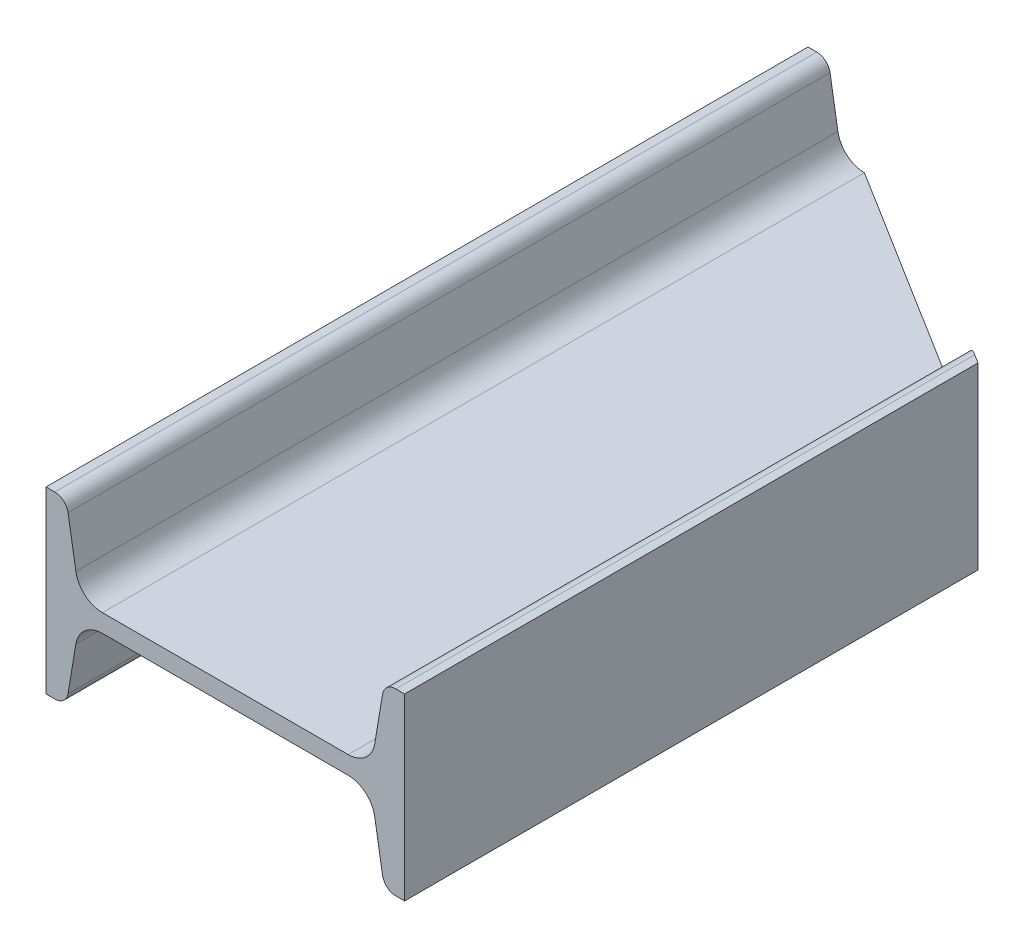
ISO-10303-21;
HEADER;
FILE_DESCRIPTION(('STEP AP214'),'2;1');
FILE_NAME('part.step','',(''),(''),'','','');
FILE_SCHEMA(('AUTOMOTIVE_DESIGN { 1 0 10303 214 1 1 1 1 }'));
ENDSEC;
DATA;
#1=APPLICATION_CONTEXT('core data for automotive mechanical design processes');
#2=APPLICATION_PROTOCOL_DEFINITION('international standard','automotive_design',2000,#1);
#3=PRODUCT_CONTEXT('',#1,'mechanical');
#4=PRODUCT('Part','Part','',(#3));
#5=PRODUCT_RELATED_PRODUCT_CATEGORY('part','',(#4));
#6=PRODUCT_DEFINITION_FORMATION('','',#4);
#7=PRODUCT_DEFINITION_CONTEXT('part definition',#1,'design');
#8=PRODUCT_DEFINITION('design','',#6,#7);
#9=PRODUCT_DEFINITION_SHAPE('','',#8);
#10=(LENGTH_UNIT() NAMED_UNIT(*) SI_UNIT(.MILLI.,.METRE.));
#11=(NAMED_UNIT(*) PLANE_ANGLE_UNIT() SI_UNIT($,.RADIAN.));
#12=(NAMED_UNIT(*) SI_UNIT($,.STERADIAN.) SOLID_ANGLE_UNIT());
#13=UNCERTAINTY_MEASURE_WITH_UNIT(LENGTH_MEASURE(1.E-05),#10,'distance_accuracy_value','');
#14=(GEOMETRIC_REPRESENTATION_CONTEXT(3) GLOBAL_UNCERTAINTY_ASSIGNED_CONTEXT((#13)) GLOBAL_UNIT_ASSIGNED_CONTEXT((#10,
#11,#12)) REPRESENTATION_CONTEXT('',''));
#15=CARTESIAN_POINT('',(0.,0.,0.));
#16=DIRECTION('',(0.,0.,1.));
#17=DIRECTION('',(1.,0.,0.));
#18=AXIS2_PLACEMENT_3D('',#15,#16,#17);
#19=CARTESIAN_POINT('',(-40.,20.,-85.));
#20=DIRECTION('',(1.,0.,0.));
#21=DIRECTION('',(0.,0.,-1.));
#22=AXIS2_PLACEMENT_3D('',#19,#20,#21);
#23=PLANE('',#22);
#24=DIRECTION('',(0.,1.,0.));
#25=VECTOR('',#24,1.);
#26=CARTESIAN_POINT('',(-40.,20.,85.));
#27=LINE('',#26,#25);
#28=CARTESIAN_POINT('',(-40.,-20.,85.));
#29=VERTEX_POINT('',#28);
#30=CARTESIAN_POINT('',(-40.,20.,85.));
#31=VERTEX_POINT('',#30);
#32=EDGE_CURVE('E239',#29,#31,#27,.T.);
#33=ORIENTED_EDGE('',*,*,#32,.T.);
#34=DIRECTION('',(0.,0.,1.));
#35=VECTOR('',#34,1.);
#36=CARTESIAN_POINT('',(-40.,20.,-85.));
#37=LINE('',#36,#35);
#38=CARTESIAN_POINT('',(-40.,20.,-85.));
#39=VERTEX_POINT('',#38);
#40=EDGE_CURVE('E107',#39,#31,#37,.T.);
#41=ORIENTED_EDGE('',*,*,#40,.F.);
#42=DIRECTION('',(0.,1.,0.));
#43=VECTOR('',#42,1.);
#44=CARTESIAN_POINT('',(-40.,20.,-85.));
#45=LINE('',#44,#43);
#46=CARTESIAN_POINT('',(-40.,-20.,-85.));
#47=VERTEX_POINT('',#46);
#48=EDGE_CURVE('E288',#47,#39,#45,.T.);
#49=ORIENTED_EDGE('',*,*,#48,.F.);
#50=DIRECTION('',(0.,0.,1.));
#51=VECTOR('',#50,1.);
#52=CARTESIAN_POINT('',(-40.,-20.,-85.));
#53=LINE('',#52,#51);
#54=EDGE_CURVE('E235',#47,#29,#53,.T.);
#55=ORIENTED_EDGE('',*,*,#54,.T.);
#56=EDGE_LOOP('',(#33,#41,#49,#55));
#57=FACE_BOUND('',#56,.T.);
#58=ADVANCED_FACE('F99',(#57),#23,.F.);
#59=CARTESIAN_POINT('',(-38.0414602116945,20.,-85.));
#60=DIRECTION('',(0.,-1.,0.));
#61=DIRECTION('',(1.,0.,0.));
#62=AXIS2_PLACEMENT_3D('',#59,#60,#61);
#63=PLANE('',#62);
#64=DIRECTION('',(1.,0.,0.));
#65=VECTOR('',#64,1.);
#66=CARTESIAN_POINT('',(-38.0414602116945,20.,85.));
#67=LINE('',#66,#65);
#68=CARTESIAN_POINT('',(-38.0414602116945,20.,85.));
#69=VERTEX_POINT('',#68);
#70=EDGE_CURVE('E242',#31,#69,#67,.T.);
#71=ORIENTED_EDGE('',*,*,#70,.T.);
#72=DIRECTION('',(0.,0.,1.));
#73=VECTOR('',#72,1.);
#74=CARTESIAN_POINT('',(-38.0414602116945,20.,-85.));
#75=LINE('',#74,#73);
#76=CARTESIAN_POINT('',(-38.0414602116945,20.,-85.));
#77=VERTEX_POINT('',#76);
#78=EDGE_CURVE('E324',#77,#69,#75,.T.);
#79=ORIENTED_EDGE('',*,*,#78,.F.);
#80=DIRECTION('',(1.,0.,0.));
#81=VECTOR('',#80,1.);
#82=CARTESIAN_POINT('',(-38.0414602116945,20.,-85.));
#83=LINE('',#82,#81);
#84=EDGE_CURVE('E196',#39,#77,#83,.T.);
#85=ORIENTED_EDGE('',*,*,#84,.F.);
#86=ORIENTED_EDGE('',*,*,#40,.T.);
#87=EDGE_LOOP('',(#71,#79,#85,#86));
#88=FACE_BOUND('',#87,.T.);
#89=ADVANCED_FACE('F327',(#88),#63,.F.);
#90=CARTESIAN_POINT('',(-38.0414602116945,17.,-85.));
#91=DIRECTION('',(0.,0.,1.));
#92=DIRECTION('',(0.,-1.,0.));
#93=AXIS2_PLACEMENT_3D('',#90,#91,#92);
#94=CYLINDRICAL_SURFACE('',#93,3.);
#95=CARTESIAN_POINT('',(-38.0414602116945,17.,85.));
#96=DIRECTION('',(0.,0.,-1.));
#97=DIRECTION('',(0.,1.,0.));
#98=AXIS2_PLACEMENT_3D('',#95,#96,#97);
#99=CIRCLE('',#98,3.);
#100=CARTESIAN_POINT('',(-35.082284274778,17.4932319681189,85.));
#101=VERTEX_POINT('',#100);
#102=EDGE_CURVE('E245',#69,#101,#99,.T.);
#103=ORIENTED_EDGE('',*,*,#102,.T.);
#104=DIRECTION('',(0.,0.,1.));
#105=VECTOR('',#104,1.);
#106=CARTESIAN_POINT('',(-35.082284274778,17.4932319681189,-85.));
#107=LINE('',#106,#105);
#108=CARTESIAN_POINT('',(-35.082284274778,17.4932319681189,-85.));
#109=VERTEX_POINT('',#108);
#110=EDGE_CURVE('E321',#109,#101,#107,.T.);
#111=ORIENTED_EDGE('',*,*,#110,.F.);
#112=CARTESIAN_POINT('',(-38.0414602116945,17.,-85.));
#113=DIRECTION('',(0.,0.,-1.));
#114=DIRECTION('',(0.,1.,0.));
#115=AXIS2_PLACEMENT_3D('',#112,#113,#114);
#116=CIRCLE('',#115,3.);
#117=EDGE_CURVE('E347',#77,#109,#116,.T.);
#118=ORIENTED_EDGE('',*,*,#117,.F.);
#119=ORIENTED_EDGE('',*,*,#78,.T.);
#120=EDGE_LOOP('',(#103,#111,#118,#119));
#121=FACE_BOUND('',#120,.T.);
#122=ADVANCED_FACE('F338',(#121),#94,.T.);
#123=CARTESIAN_POINT('',(-33.3355408751344,7.01353606376229,-85.));
#124=DIRECTION('',(-0.986391978972163,-0.164410656039623,0.));
#125=DIRECTION('',(0.164410656039623,-0.986391978972163,0.));
#126=AXIS2_PLACEMENT_3D('',#123,#124,#125);
#127=PLANE('',#126);
#128=DIRECTION('',(0.164410656039623,-0.986391978972163,0.));
#129=VECTOR('',#128,1.);
#130=CARTESIAN_POINT('',(-33.3355408751344,7.01353606376226,85.));
#131=LINE('',#130,#129);
#132=CARTESIAN_POINT('',(-33.3355408751344,7.01353606376226,85.));
#133=VERTEX_POINT('',#132);
#134=EDGE_CURVE('E247',#101,#133,#131,.T.);
#135=ORIENTED_EDGE('',*,*,#134,.T.);
#136=DIRECTION('',(0.,0.,1.));
#137=VECTOR('',#136,1.);
#138=CARTESIAN_POINT('',(-33.3355408751344,7.01353606376229,-85.));
#139=LINE('',#138,#137);
#140=CARTESIAN_POINT('',(-33.3355408751344,7.01353606376229,-85.));
#141=VERTEX_POINT('',#140);
#142=EDGE_CURVE('E318',#141,#133,#139,.T.);
#143=ORIENTED_EDGE('',*,*,#142,.F.);
#144=DIRECTION('',(0.164410656039623,-0.986391978972163,0.));
#145=VECTOR('',#144,1.);
#146=CARTESIAN_POINT('',(-33.3355408751344,7.01353606376229,-85.));
#147=LINE('',#146,#145);
#148=EDGE_CURVE('E344',#109,#141,#147,.T.);
#149=ORIENTED_EDGE('',*,*,#148,.F.);
#150=ORIENTED_EDGE('',*,*,#110,.T.);
#151=EDGE_LOOP('',(#135,#143,#149,#150));
#152=FACE_BOUND('',#151,.T.);
#153=ADVANCED_FACE('F342',(#152),#127,.F.);
#154=CARTESIAN_POINT('',(-27.4171890013014,8.00000000000003,-85.));
#155=DIRECTION('',(0.,0.,1.));
#156=DIRECTION('',(0.,-1.,0.));
#157=AXIS2_PLACEMENT_3D('',#154,#155,#156);
#158=CYLINDRICAL_SURFACE('',#157,6.);
#159=CARTESIAN_POINT('',(-27.4171890013014,8.,85.));
#160=DIRECTION('',(0.,0.,1.));
#161=DIRECTION('',(0.,1.,0.));
#162=AXIS2_PLACEMENT_3D('',#159,#160,#161);
#163=CIRCLE('',#162,6.);
#164=CARTESIAN_POINT('',(-27.4171890013014,1.99999999999999,85.));
#165=VERTEX_POINT('',#164);
#166=EDGE_CURVE('E249',#133,#165,#163,.T.);
#167=ORIENTED_EDGE('',*,*,#166,.T.);
#168=DIRECTION('',(0.,0.,1.));
#169=VECTOR('',#168,1.);
#170=CARTESIAN_POINT('',(-27.4171890013014,2.00000000000003,-85.));
#171=LINE('',#170,#169);
#172=CARTESIAN_POINT('',(-27.4171890013014,2.00000000000003,-85.));
#173=VERTEX_POINT('',#172);
#174=EDGE_CURVE('E315',#173,#165,#171,.T.);
#175=ORIENTED_EDGE('',*,*,#174,.F.);
#176=CARTESIAN_POINT('',(-27.4171890013014,8.00000000000003,-85.));
#177=DIRECTION('',(0.,0.,1.));
#178=DIRECTION('',(0.,1.,0.));
#179=AXIS2_PLACEMENT_3D('',#176,#177,#178);
#180=CIRCLE('',#179,6.);
#181=EDGE_CURVE('E346',#141,#173,#180,.T.);
#182=ORIENTED_EDGE('',*,*,#181,.F.);
#183=ORIENTED_EDGE('',*,*,#142,.T.);
#184=EDGE_LOOP('',(#167,#175,#182,#183));
#185=FACE_BOUND('',#184,.T.);
#186=ADVANCED_FACE('F446',(#185),#158,.F.);
#187=CARTESIAN_POINT('',(27.4171890013014,2.00000000000003,-85.));
#188=DIRECTION('',(0.,-1.,0.));
#189=DIRECTION('',(0.,0.,-1.));
#190=AXIS2_PLACEMENT_3D('',#187,#188,#189);
#191=PLANE('',#190);
#192=DIRECTION('',(0.,0.,1.));
#193=VECTOR('',#192,1.);
#194=CARTESIAN_POINT('',(27.4171890013014,2.00000000000003,-85.));
#195=LINE('',#194,#193);
#196=CARTESIAN_POINT('',(27.4171890013014,2.00000000000003,-50.7756087656373));
#197=VERTEX_POINT('',#196);
#198=CARTESIAN_POINT('',(27.4171890013014,2.,85.));
#199=VERTEX_POINT('',#198);
#200=EDGE_CURVE('E313',#197,#199,#195,.T.);
#201=ORIENTED_EDGE('',*,*,#200,.F.);
#202=DIRECTION('',(-0.848325599390186,0.,-0.529474907261224));
#203=VECTOR('',#202,1.);
#204=CARTESIAN_POINT('',(12.0447178230528,2.00000000000002,-60.3702004617147));
#205=LINE('',#204,#203);
#206=EDGE_CURVE('E243',#197,#173,#205,.T.);
#207=ORIENTED_EDGE('',*,*,#206,.T.);
#208=ORIENTED_EDGE('',*,*,#174,.T.);
#209=DIRECTION('',(1.,0.,0.));
#210=VECTOR('',#209,1.);
#211=CARTESIAN_POINT('',(27.4171890013014,1.99999999999999,85.));
#212=LINE('',#211,#210);
#213=EDGE_CURVE('E251',#165,#199,#212,.T.);
#214=ORIENTED_EDGE('',*,*,#213,.T.);
#215=EDGE_LOOP('',(#201,#207,#208,#214));
#216=FACE_BOUND('',#215,.T.);
#217=ADVANCED_FACE('F450',(#216),#191,.F.);
#218=CARTESIAN_POINT('',(27.4171890013014,8.00000000000004,-85.));
#219=DIRECTION('',(0.,0.,1.));
#220=DIRECTION('',(0.,-1.,0.));
#221=AXIS2_PLACEMENT_3D('',#218,#219,#220);
#222=CYLINDRICAL_SURFACE('',#221,6.00000000000001);
#223=DIRECTION('',(0.,0.,1.));
#224=VECTOR('',#223,1.);
#225=CARTESIAN_POINT('',(33.3355408751344,7.0135360637623,-85.));
#226=LINE('',#225,#224);
#227=CARTESIAN_POINT('',(33.3355408751343,7.01353606376227,-47.0817218762288));
#228=VERTEX_POINT('',#227);
#229=CARTESIAN_POINT('',(33.3355408751344,7.01353606376227,85.));
#230=VERTEX_POINT('',#229);
#231=EDGE_CURVE('E311',#228,#230,#226,.T.);
#232=ORIENTED_EDGE('',*,*,#231,.F.);
#233=CARTESIAN_POINT('',(27.4171890013014,8.00000000000003,-50.7756087656373));
#234=DIRECTION('',(-0.529474907261224,0.,0.848325599390186));
#235=DIRECTION('',(0.848325599390186,0.,0.529474907261224));
#236=AXIS2_PLACEMENT_3D('',#233,#234,#235);
#237=ELLIPSE('',#236,7.07275603177963,6.00000000000001);
#238=EDGE_CURVE('E356',#228,#197,#237,.F.);
#239=ORIENTED_EDGE('',*,*,#238,.T.);
#240=ORIENTED_EDGE('',*,*,#200,.T.);
#241=CARTESIAN_POINT('',(27.4171890013014,8.00000000000001,85.));
#242=DIRECTION('',(0.,0.,1.));
#243=DIRECTION('',(0.,1.,0.));
#244=AXIS2_PLACEMENT_3D('',#241,#242,#243);
#245=CIRCLE('',#244,6.00000000000001);
#246=EDGE_CURVE('E254',#199,#230,#245,.T.);
#247=ORIENTED_EDGE('',*,*,#246,.T.);
#248=EDGE_LOOP('',(#232,#239,#240,#247));
#249=FACE_BOUND('',#248,.T.);
#250=ADVANCED_FACE('F455',(#249),#222,.F.);
#251=CARTESIAN_POINT('',(35.082284274778,17.4932319681189,-85.));
#252=DIRECTION('',(0.986391978972163,-0.164410656039623,0.));
#253=DIRECTION('',(0.164410656039623,0.986391978972163,0.));
#254=AXIS2_PLACEMENT_3D('',#251,#252,#253);
#255=PLANE('',#254);
#256=DIRECTION('',(0.,0.,1.));
#257=VECTOR('',#256,1.);
#258=CARTESIAN_POINT('',(35.082284274778,17.4932319681189,-85.));
#259=LINE('',#258,#257);
#260=CARTESIAN_POINT('',(35.082284274778,17.4932319681189,-45.991507458321));
#261=VERTEX_POINT('',#260);
#262=CARTESIAN_POINT('',(35.082284274778,17.4932319681189,85.));
#263=VERTEX_POINT('',#262);
#264=EDGE_CURVE('E309',#261,#263,#259,.T.);
#265=ORIENTED_EDGE('',*,*,#264,.F.);
#266=DIRECTION('',(-0.163551816290353,-0.981239316363125,-0.102079417177778));
#267=VECTOR('',#266,1.);
#268=CARTESIAN_POINT('',(34.4310268001408,13.5859721547832,-46.3979840414096));
#269=LINE('',#268,#267);
#270=EDGE_CURVE('E359',#261,#228,#269,.T.);
#271=ORIENTED_EDGE('',*,*,#270,.T.);
#272=ORIENTED_EDGE('',*,*,#231,.T.);
#273=DIRECTION('',(0.164410656039623,0.986391978972163,0.));
#274=VECTOR('',#273,1.);
#275=CARTESIAN_POINT('',(35.082284274778,17.4932319681189,85.));
#276=LINE('',#275,#274);
#277=EDGE_CURVE('E257',#230,#263,#276,.T.);
#278=ORIENTED_EDGE('',*,*,#277,.T.);
#279=EDGE_LOOP('',(#265,#271,#272,#278));
#280=FACE_BOUND('',#279,.T.);
#281=ADVANCED_FACE('F463',(#280),#255,.F.);
#282=CARTESIAN_POINT('',(38.0414602116944,17.,-85.));
#283=DIRECTION('',(0.,0.,1.));
#284=DIRECTION('',(0.,-1.,0.));
#285=AXIS2_PLACEMENT_3D('',#282,#283,#284);
#286=CYLINDRICAL_SURFACE('',#285,3.);
#287=DIRECTION('',(0.,0.,1.));
#288=VECTOR('',#287,1.);
#289=CARTESIAN_POINT('',(38.0414602116945,20.,-85.));
#290=LINE('',#289,#288);
#291=CARTESIAN_POINT('',(38.0414602116945,20.,-44.1445640136168));
#292=VERTEX_POINT('',#291);
#293=CARTESIAN_POINT('',(38.0414602116945,20.,85.));
#294=VERTEX_POINT('',#293);
#295=EDGE_CURVE('E307',#292,#294,#290,.T.);
#296=ORIENTED_EDGE('',*,*,#295,.F.);
#297=CARTESIAN_POINT('',(38.0414602116944,17.,-44.1445640136168));
#298=DIRECTION('',(-0.529474907261224,0.,0.848325599390186));
#299=DIRECTION('',(0.848325599390186,0.,0.529474907261224));
#300=AXIS2_PLACEMENT_3D('',#297,#298,#299);
#301=ELLIPSE('',#300,3.53637801588981,3.);
#302=EDGE_CURVE('E362',#292,#261,#301,.T.);
#303=ORIENTED_EDGE('',*,*,#302,.T.);
#304=ORIENTED_EDGE('',*,*,#264,.T.);
#305=CARTESIAN_POINT('',(38.0414602116944,17.,85.));
#306=DIRECTION('',(0.,0.,-1.));
#307=DIRECTION('',(0.,1.,0.));
#308=AXIS2_PLACEMENT_3D('',#305,#306,#307);
#309=CIRCLE('',#308,3.);
#310=EDGE_CURVE('E260',#263,#294,#309,.T.);
#311=ORIENTED_EDGE('',*,*,#310,.T.);
#312=EDGE_LOOP('',(#296,#303,#304,#311));
#313=FACE_BOUND('',#312,.T.);
#314=ADVANCED_FACE('F462',(#313),#286,.T.);
#315=CARTESIAN_POINT('',(40.,20.,-85.));
#316=DIRECTION('',(0.,-1.,0.));
#317=DIRECTION('',(1.,0.,0.));
#318=AXIS2_PLACEMENT_3D('',#315,#316,#317);
#319=PLANE('',#318);
#320=DIRECTION('',(0.,0.,1.));
#321=VECTOR('',#320,1.);
#322=CARTESIAN_POINT('',(40.,20.,-85.));
#323=LINE('',#322,#321);
#324=CARTESIAN_POINT('',(40.,20.,-42.9221587561002));
#325=VERTEX_POINT('',#324);
#326=CARTESIAN_POINT('',(40.,20.,85.));
#327=VERTEX_POINT('',#326);
#328=EDGE_CURVE('E305',#325,#327,#323,.T.);
#329=ORIENTED_EDGE('',*,*,#328,.F.);
#330=DIRECTION('',(0.848325599390186,0.,0.529474907261224));
#331=VECTOR('',#330,1.);
#332=CARTESIAN_POINT('',(-27.4171890013014,20.,-85.));
#333=LINE('',#332,#331);
#334=EDGE_CURVE('E383',#292,#325,#333,.T.);
#335=ORIENTED_EDGE('',*,*,#334,.F.);
#336=ORIENTED_EDGE('',*,*,#295,.T.);
#337=DIRECTION('',(1.,0.,0.));
#338=VECTOR('',#337,1.);
#339=CARTESIAN_POINT('',(40.,20.,85.));
#340=LINE('',#339,#338);
#341=EDGE_CURVE('E263',#294,#327,#340,.T.);
#342=ORIENTED_EDGE('',*,*,#341,.T.);
#343=EDGE_LOOP('',(#329,#335,#336,#342));
#344=FACE_BOUND('',#343,.T.);
#345=ADVANCED_FACE('F404',(#344),#319,.F.);
#346=CARTESIAN_POINT('',(40.,-20.,-85.));
#347=DIRECTION('',(-1.,0.,0.));
#348=DIRECTION('',(0.,-1.,0.));
#349=AXIS2_PLACEMENT_3D('',#346,#347,#348);
#350=PLANE('',#349);
#351=DIRECTION('',(0.,0.,1.));
#352=VECTOR('',#351,1.);
#353=CARTESIAN_POINT('',(40.,-20.,-85.));
#354=LINE('',#353,#352);
#355=CARTESIAN_POINT('',(40.,-20.,-42.9221587561002));
#356=VERTEX_POINT('',#355);
#357=CARTESIAN_POINT('',(40.,-20.,85.));
#358=VERTEX_POINT('',#357);
#359=EDGE_CURVE('E303',#356,#358,#354,.T.);
#360=ORIENTED_EDGE('',*,*,#359,.F.);
#361=DIRECTION('',(0.,1.,0.));
#362=VECTOR('',#361,1.);
#363=CARTESIAN_POINT('',(40.,-20.,-42.9221587561002));
#364=LINE('',#363,#362);
#365=EDGE_CURVE('E365',#356,#325,#364,.T.);
#366=ORIENTED_EDGE('',*,*,#365,.T.);
#367=ORIENTED_EDGE('',*,*,#328,.T.);
#368=DIRECTION('',(0.,-1.,0.));
#369=VECTOR('',#368,1.);
#370=CARTESIAN_POINT('',(40.,-20.,85.));
#371=LINE('',#370,#369);
#372=EDGE_CURVE('E266',#327,#358,#371,.T.);
#373=ORIENTED_EDGE('',*,*,#372,.T.);
#374=EDGE_LOOP('',(#360,#366,#367,#373));
#375=FACE_BOUND('',#374,.T.);
#376=ADVANCED_FACE('F403',(#375),#350,.F.);
#377=CARTESIAN_POINT('',(38.0414602116945,-20.,-85.));
#378=DIRECTION('',(0.,1.,0.));
#379=DIRECTION('',(-1.,0.,0.));
#380=AXIS2_PLACEMENT_3D('',#377,#378,#379);
#381=PLANE('',#380);
#382=DIRECTION('',(0.,0.,1.));
#383=VECTOR('',#382,1.);
#384=CARTESIAN_POINT('',(38.0414602116945,-20.,-85.));
#385=LINE('',#384,#383);
#386=CARTESIAN_POINT('',(38.0414602116945,-20.,-44.1445640136168));
#387=VERTEX_POINT('',#386);
#388=CARTESIAN_POINT('',(38.0414602116945,-20.,85.));
#389=VERTEX_POINT('',#388);
#390=EDGE_CURVE('E301',#387,#389,#385,.T.);
#391=ORIENTED_EDGE('',*,*,#390,.F.);
#392=DIRECTION('',(0.848325599390186,0.,0.529474907261224));
#393=VECTOR('',#392,1.);
#394=CARTESIAN_POINT('',(-27.4171890013014,-20.,-85.));
#395=LINE('',#394,#393);
#396=EDGE_CURVE('E380',#387,#356,#395,.T.);
#397=ORIENTED_EDGE('',*,*,#396,.T.);
#398=ORIENTED_EDGE('',*,*,#359,.T.);
#399=DIRECTION('',(-1.,0.,0.));
#400=VECTOR('',#399,1.);
#401=CARTESIAN_POINT('',(38.0414602116945,-20.,85.));
#402=LINE('',#401,#400);
#403=EDGE_CURVE('E269',#358,#389,#402,.T.);
#404=ORIENTED_EDGE('',*,*,#403,.T.);
#405=EDGE_LOOP('',(#391,#397,#398,#404));
#406=FACE_BOUND('',#405,.T.);
#407=ADVANCED_FACE('F413',(#406),#381,.F.);
#408=CARTESIAN_POINT('',(38.0414602116945,-17.,-85.));
#409=DIRECTION('',(0.,0.,1.));
#410=DIRECTION('',(0.,-1.,0.));
#411=AXIS2_PLACEMENT_3D('',#408,#409,#410);
#412=CYLINDRICAL_SURFACE('',#411,3.);
#413=DIRECTION('',(0.,0.,1.));
#414=VECTOR('',#413,1.);
#415=CARTESIAN_POINT('',(35.082284274778,-17.4932319681188,-85.));
#416=LINE('',#415,#414);
#417=CARTESIAN_POINT('',(35.082284274778,-17.4932319681188,-45.991507458321));
#418=VERTEX_POINT('',#417);
#419=CARTESIAN_POINT('',(35.082284274778,-17.4932319681188,85.));
#420=VERTEX_POINT('',#419);
#421=EDGE_CURVE('E299',#418,#420,#416,.T.);
#422=ORIENTED_EDGE('',*,*,#421,.F.);
#423=CARTESIAN_POINT('',(38.0414602116945,-17.,-44.1445640136168));
#424=DIRECTION('',(-0.529474907261224,0.,0.848325599390186));
#425=DIRECTION('',(0.848325599390186,0.,0.529474907261224));
#426=AXIS2_PLACEMENT_3D('',#423,#424,#425);
#427=ELLIPSE('',#426,3.53637801588981,3.);
#428=EDGE_CURVE('E368',#418,#387,#427,.T.);
#429=ORIENTED_EDGE('',*,*,#428,.T.);
#430=ORIENTED_EDGE('',*,*,#390,.T.);
#431=CARTESIAN_POINT('',(38.0414602116945,-17.,85.));
#432=DIRECTION('',(0.,0.,-1.));
#433=DIRECTION('',(0.,-1.,0.));
#434=AXIS2_PLACEMENT_3D('',#431,#432,#433);
#435=CIRCLE('',#434,3.);
#436=EDGE_CURVE('E272',#389,#420,#435,.T.);
#437=ORIENTED_EDGE('',*,*,#436,.T.);
#438=EDGE_LOOP('',(#422,#429,#430,#437));
#439=FACE_BOUND('',#438,.T.);
#440=ADVANCED_FACE('F422',(#439),#412,.T.);
#441=CARTESIAN_POINT('',(33.3355408751344,-7.01353606376222,-85.));
#442=DIRECTION('',(0.986391978972163,0.164410656039624,0.));
#443=DIRECTION('',(-0.164410656039624,0.986391978972163,0.));
#444=AXIS2_PLACEMENT_3D('',#441,#442,#443);
#445=PLANE('',#444);
#446=DIRECTION('',(0.,0.,1.));
#447=VECTOR('',#446,1.);
#448=CARTESIAN_POINT('',(33.3355408751343,-7.01353606376222,-85.));
#449=LINE('',#448,#447);
#450=CARTESIAN_POINT('',(33.3355408751343,-7.01353606376223,-47.0817218762288));
#451=VERTEX_POINT('',#450);
#452=CARTESIAN_POINT('',(33.3355408751343,-7.01353606376225,85.));
#453=VERTEX_POINT('',#452);
#454=EDGE_CURVE('E297',#451,#453,#449,.T.);
#455=ORIENTED_EDGE('',*,*,#454,.F.);
#456=DIRECTION('',(0.163551816290353,-0.981239316363124,0.102079417177778));
#457=VECTOR('',#456,1.);
#458=CARTESIAN_POINT('',(32.7024848290159,-3.21547685535785,-47.4768381989599));
#459=LINE('',#458,#457);
#460=EDGE_CURVE('E371',#451,#418,#459,.T.);
#461=ORIENTED_EDGE('',*,*,#460,.T.);
#462=ORIENTED_EDGE('',*,*,#421,.T.);
#463=DIRECTION('',(-0.164410656039624,0.986391978972163,0.));
#464=VECTOR('',#463,1.);
#465=CARTESIAN_POINT('',(33.3355408751344,-7.01353606376225,85.));
#466=LINE('',#465,#464);
#467=EDGE_CURVE('E275',#420,#453,#466,.T.);
#468=ORIENTED_EDGE('',*,*,#467,.T.);
#469=EDGE_LOOP('',(#455,#461,#462,#468));
#470=FACE_BOUND('',#469,.T.);
#471=ADVANCED_FACE('F428',(#470),#445,.F.);
#472=CARTESIAN_POINT('',(27.4171890013014,-7.99999999999997,-85.));
#473=DIRECTION('',(0.,0.,1.));
#474=DIRECTION('',(0.,-1.,0.));
#475=AXIS2_PLACEMENT_3D('',#472,#473,#474);
#476=CYLINDRICAL_SURFACE('',#475,6.);
#477=DIRECTION('',(0.,0.,1.));
#478=VECTOR('',#477,1.);
#479=CARTESIAN_POINT('',(27.4171890013014,-1.99999999999997,-85.));
#480=LINE('',#479,#478);
#481=CARTESIAN_POINT('',(27.4171890013014,-1.99999999999998,-50.7756087656373));
#482=VERTEX_POINT('',#481);
#483=CARTESIAN_POINT('',(27.4171890013014,-2.00000000000001,85.));
#484=VERTEX_POINT('',#483);
#485=EDGE_CURVE('E295',#482,#484,#480,.T.);
#486=ORIENTED_EDGE('',*,*,#485,.F.);
#487=CARTESIAN_POINT('',(27.4171890013014,-7.99999999999997,-50.7756087656373));
#488=DIRECTION('',(-0.529474907261224,0.,0.848325599390186));
#489=DIRECTION('',(0.848325599390186,0.,0.529474907261224));
#490=AXIS2_PLACEMENT_3D('',#487,#488,#489);
#491=ELLIPSE('',#490,7.07275603177961,6.);
#492=EDGE_CURVE('E374',#482,#451,#491,.F.);
#493=ORIENTED_EDGE('',*,*,#492,.T.);
#494=ORIENTED_EDGE('',*,*,#454,.T.);
#495=CARTESIAN_POINT('',(27.4171890013014,-8.,85.));
#496=DIRECTION('',(0.,0.,1.));
#497=DIRECTION('',(0.,1.,0.));
#498=AXIS2_PLACEMENT_3D('',#495,#496,#497);
#499=CIRCLE('',#498,6.);
#500=EDGE_CURVE('E278',#453,#484,#499,.T.);
#501=ORIENTED_EDGE('',*,*,#500,.T.);
#502=EDGE_LOOP('',(#486,#493,#494,#501));
#503=FACE_BOUND('',#502,.T.);
#504=ADVANCED_FACE('F435',(#503),#476,.F.);
#505=CARTESIAN_POINT('',(-27.4171890013014,-1.99999999999997,-85.));
#506=DIRECTION('',(0.,1.,0.));
#507=DIRECTION('',(0.,0.,1.));
#508=AXIS2_PLACEMENT_3D('',#505,#506,#507);
#509=PLANE('',#508);
#510=DIRECTION('',(0.,0.,1.));
#511=VECTOR('',#510,1.);
#512=CARTESIAN_POINT('',(-27.4171890013014,-1.99999999999997,-85.));
#513=LINE('',#512,#511);
#514=CARTESIAN_POINT('',(-27.4171890013014,-1.99999999999997,-85.));
#515=VERTEX_POINT('',#514);
#516=CARTESIAN_POINT('',(-27.4171890013014,-2.,85.));
#517=VERTEX_POINT('',#516);
#518=EDGE_CURVE('E292',#515,#517,#513,.T.);
#519=ORIENTED_EDGE('',*,*,#518,.F.);
#520=DIRECTION('',(0.848325599390186,0.,0.529474907261224));
#521=VECTOR('',#520,1.);
#522=CARTESIAN_POINT('',(-27.4171890013014,-1.99999999999997,-85.));
#523=LINE('',#522,#521);
#524=EDGE_CURVE('E377',#515,#482,#523,.T.);
#525=ORIENTED_EDGE('',*,*,#524,.T.);
#526=ORIENTED_EDGE('',*,*,#485,.T.);
#527=DIRECTION('',(-1.,0.,0.));
#528=VECTOR('',#527,1.);
#529=CARTESIAN_POINT('',(-27.4171890013014,-2.00000000000001,85.));
#530=LINE('',#529,#528);
#531=EDGE_CURVE('E281',#484,#517,#530,.T.);
#532=ORIENTED_EDGE('',*,*,#531,.T.);
#533=EDGE_LOOP('',(#519,#525,#526,#532));
#534=FACE_BOUND('',#533,.T.);
#535=ADVANCED_FACE('F440',(#534),#509,.F.);
#536=CARTESIAN_POINT('',(-27.4171890013014,-7.99999999999997,-85.));
#537=DIRECTION('',(0.,0.,1.));
#538=DIRECTION('',(0.,-1.,0.));
#539=AXIS2_PLACEMENT_3D('',#536,#537,#538);
#540=CYLINDRICAL_SURFACE('',#539,6.);
#541=CARTESIAN_POINT('',(-27.4171890013014,-8.,85.));
#542=DIRECTION('',(0.,0.,1.));
#543=DIRECTION('',(0.,1.,0.));
#544=AXIS2_PLACEMENT_3D('',#541,#542,#543);
#545=CIRCLE('',#544,6.);
#546=CARTESIAN_POINT('',(-33.3355408751344,-7.01353606376226,85.));
#547=VERTEX_POINT('',#546);
#548=EDGE_CURVE('E283',#517,#547,#545,.T.);
#549=ORIENTED_EDGE('',*,*,#548,.T.);
#550=DIRECTION('',(0.,0.,1.));
#551=VECTOR('',#550,1.);
#552=CARTESIAN_POINT('',(-33.3355408751344,-7.01353606376223,-85.));
#553=LINE('',#552,#551);
#554=CARTESIAN_POINT('',(-33.3355408751344,-7.01353606376223,-85.));
#555=VERTEX_POINT('',#554);
#556=EDGE_CURVE('E230',#555,#547,#553,.T.);
#557=ORIENTED_EDGE('',*,*,#556,.F.);
#558=CARTESIAN_POINT('',(-27.4171890013014,-7.99999999999997,-85.));
#559=DIRECTION('',(0.,0.,1.));
#560=DIRECTION('',(0.,1.,0.));
#561=AXIS2_PLACEMENT_3D('',#558,#559,#560);
#562=CIRCLE('',#561,6.);
#563=EDGE_CURVE('E221',#515,#555,#562,.T.);
#564=ORIENTED_EDGE('',*,*,#563,.F.);
#565=ORIENTED_EDGE('',*,*,#518,.T.);
#566=EDGE_LOOP('',(#549,#557,#564,#565));
#567=FACE_BOUND('',#566,.T.);
#568=ADVANCED_FACE('F570',(#567),#540,.F.);
#569=CARTESIAN_POINT('',(-35.082284274778,-17.4932319681188,-85.));
#570=DIRECTION('',(-0.986391978972163,0.164410656039623,0.));
#571=DIRECTION('',(-0.164410656039623,-0.986391978972163,0.));
#572=AXIS2_PLACEMENT_3D('',#569,#570,#571);
#573=PLANE('',#572);
#574=DIRECTION('',(-0.164410656039623,-0.986391978972163,0.));
#575=VECTOR('',#574,1.);
#576=CARTESIAN_POINT('',(-35.082284274778,-17.4932319681188,85.));
#577=LINE('',#576,#575);
#578=CARTESIAN_POINT('',(-35.082284274778,-17.4932319681188,85.));
#579=VERTEX_POINT('',#578);
#580=EDGE_CURVE('E229',#547,#579,#577,.T.);
#581=ORIENTED_EDGE('',*,*,#580,.T.);
#582=DIRECTION('',(0.,0.,1.));
#583=VECTOR('',#582,1.);
#584=CARTESIAN_POINT('',(-35.082284274778,-17.4932319681188,-85.));
#585=LINE('',#584,#583);
#586=CARTESIAN_POINT('',(-35.082284274778,-17.4932319681188,-85.));
#587=VERTEX_POINT('',#586);
#588=EDGE_CURVE('E226',#587,#579,#585,.T.);
#589=ORIENTED_EDGE('',*,*,#588,.F.);
#590=DIRECTION('',(-0.164410656039623,-0.986391978972163,0.));
#591=VECTOR('',#590,1.);
#592=CARTESIAN_POINT('',(-35.082284274778,-17.4932319681188,-85.));
#593=LINE('',#592,#591);
#594=EDGE_CURVE('E214',#555,#587,#593,.T.);
#595=ORIENTED_EDGE('',*,*,#594,.F.);
#596=ORIENTED_EDGE('',*,*,#556,.T.);
#597=EDGE_LOOP('',(#581,#589,#595,#596));
#598=FACE_BOUND('',#597,.T.);
#599=ADVANCED_FACE('F227',(#598),#573,.F.);
#600=CARTESIAN_POINT('',(-38.0414602116944,-17.,-85.));
#601=DIRECTION('',(0.,0.,1.));
#602=DIRECTION('',(0.,-1.,0.));
#603=AXIS2_PLACEMENT_3D('',#600,#601,#602);
#604=CYLINDRICAL_SURFACE('',#603,3.);
#605=CARTESIAN_POINT('',(-38.0414602116944,-17.,85.));
#606=DIRECTION('',(0.,0.,-1.));
#607=DIRECTION('',(0.,-1.,0.));
#608=AXIS2_PLACEMENT_3D('',#605,#606,#607);
#609=CIRCLE('',#608,3.);
#610=CARTESIAN_POINT('',(-38.0414602116945,-20.,85.));
#611=VERTEX_POINT('',#610);
#612=EDGE_CURVE('E181',#579,#611,#609,.T.);
#613=ORIENTED_EDGE('',*,*,#612,.T.);
#614=DIRECTION('',(0.,0.,1.));
#615=VECTOR('',#614,1.);
#616=CARTESIAN_POINT('',(-38.0414602116945,-20.,-85.));
#617=LINE('',#616,#615);
#618=CARTESIAN_POINT('',(-38.0414602116945,-20.,-85.));
#619=VERTEX_POINT('',#618);
#620=EDGE_CURVE('E231',#619,#611,#617,.T.);
#621=ORIENTED_EDGE('',*,*,#620,.F.);
#622=CARTESIAN_POINT('',(-38.0414602116944,-17.,-85.));
#623=DIRECTION('',(0.,0.,-1.));
#624=DIRECTION('',(0.,-1.,0.));
#625=AXIS2_PLACEMENT_3D('',#622,#623,#624);
#626=CIRCLE('',#625,3.);
#627=EDGE_CURVE('E219',#587,#619,#626,.T.);
#628=ORIENTED_EDGE('',*,*,#627,.F.);
#629=ORIENTED_EDGE('',*,*,#588,.T.);
#630=EDGE_LOOP('',(#613,#621,#628,#629));
#631=FACE_BOUND('',#630,.T.);
#632=ADVANCED_FACE('F233',(#631),#604,.T.);
#633=CARTESIAN_POINT('',(-40.,-20.,-85.));
#634=DIRECTION('',(0.,1.,0.));
#635=DIRECTION('',(0.,0.,1.));
#636=AXIS2_PLACEMENT_3D('',#633,#634,#635);
#637=PLANE('',#636);
#638=DIRECTION('',(-1.,0.,0.));
#639=VECTOR('',#638,1.);
#640=CARTESIAN_POINT('',(-40.,-20.,85.));
#641=LINE('',#640,#639);
#642=EDGE_CURVE('E187',#611,#29,#641,.T.);
#643=ORIENTED_EDGE('',*,*,#642,.T.);
#644=ORIENTED_EDGE('',*,*,#54,.F.);
#645=DIRECTION('',(-1.,0.,0.));
#646=VECTOR('',#645,1.);
#647=CARTESIAN_POINT('',(-40.,-20.,-85.));
#648=LINE('',#647,#646);
#649=EDGE_CURVE('E115',#619,#47,#648,.T.);
#650=ORIENTED_EDGE('',*,*,#649,.F.);
#651=ORIENTED_EDGE('',*,*,#620,.T.);
#652=EDGE_LOOP('',(#643,#644,#650,#651));
#653=FACE_BOUND('',#652,.T.);
#654=ADVANCED_FACE('F592',(#653),#637,.F.);
#655=CARTESIAN_POINT('',(-38.0414602116944,-17.,-85.));
#656=DIRECTION('',(0.,0.,1.));
#657=DIRECTION('',(0.,-1.,0.));
#658=AXIS2_PLACEMENT_3D('',#655,#656,#657);
#659=PLANE('',#658);
#660=ORIENTED_EDGE('',*,*,#181,.T.);
#661=DIRECTION('',(0.,-1.,0.));
#662=VECTOR('',#661,1.);
#663=CARTESIAN_POINT('',(-27.4171890013014,-17.,-85.));
#664=LINE('',#663,#662);
#665=EDGE_CURVE('E13',#173,#515,#664,.T.);
#666=ORIENTED_EDGE('',*,*,#665,.T.);
#667=ORIENTED_EDGE('',*,*,#563,.T.);
#668=ORIENTED_EDGE('',*,*,#594,.T.);
#669=ORIENTED_EDGE('',*,*,#627,.T.);
#670=ORIENTED_EDGE('',*,*,#649,.T.);
#671=ORIENTED_EDGE('',*,*,#48,.T.);
#672=ORIENTED_EDGE('',*,*,#84,.T.);
#673=ORIENTED_EDGE('',*,*,#117,.T.);
#674=ORIENTED_EDGE('',*,*,#148,.T.);
#675=EDGE_LOOP('',(#660,#666,#667,#668,#669,#670,#671,#672,#673,#674));
#676=FACE_BOUND('',#675,.T.);
#677=ADVANCED_FACE('F217',(#676),#659,.F.);
#678=CARTESIAN_POINT('',(-38.0414602116944,-17.,85.));
#679=DIRECTION('',(0.,0.,1.));
#680=DIRECTION('',(0.,-1.,0.));
#681=AXIS2_PLACEMENT_3D('',#678,#679,#680);
#682=PLANE('',#681);
#683=ORIENTED_EDGE('',*,*,#32,.F.);
#684=ORIENTED_EDGE('',*,*,#642,.F.);
#685=ORIENTED_EDGE('',*,*,#612,.F.);
#686=ORIENTED_EDGE('',*,*,#580,.F.);
#687=ORIENTED_EDGE('',*,*,#548,.F.);
#688=ORIENTED_EDGE('',*,*,#531,.F.);
#689=ORIENTED_EDGE('',*,*,#500,.F.);
#690=ORIENTED_EDGE('',*,*,#467,.F.);
#691=ORIENTED_EDGE('',*,*,#436,.F.);
#692=ORIENTED_EDGE('',*,*,#403,.F.);
#693=ORIENTED_EDGE('',*,*,#372,.F.);
#694=ORIENTED_EDGE('',*,*,#341,.F.);
#695=ORIENTED_EDGE('',*,*,#310,.F.);
#696=ORIENTED_EDGE('',*,*,#277,.F.);
#697=ORIENTED_EDGE('',*,*,#246,.F.);
#698=ORIENTED_EDGE('',*,*,#213,.F.);
#699=ORIENTED_EDGE('',*,*,#166,.F.);
#700=ORIENTED_EDGE('',*,*,#134,.F.);
#701=ORIENTED_EDGE('',*,*,#102,.F.);
#702=ORIENTED_EDGE('',*,*,#70,.F.);
#703=EDGE_LOOP('',(#683,#684,#685,#686,#687,#688,#689,#690,#691,#692,#693,#694,#695,#696,#697,
#698,#699,#700,#701,#702));
#704=FACE_BOUND('',#703,.T.);
#705=ADVANCED_FACE('F332',(#704),#682,.T.);
#706=CARTESIAN_POINT('',(-27.4171890013014,-20.,-85.));
#707=DIRECTION('',(-0.529474907261224,0.,0.848325599390186));
#708=DIRECTION('',(0.848325599390186,0.,0.529474907261224));
#709=AXIS2_PLACEMENT_3D('',#706,#707,#708);
#710=PLANE('',#709);
#711=ORIENTED_EDGE('',*,*,#238,.F.);
#712=ORIENTED_EDGE('',*,*,#270,.F.);
#713=ORIENTED_EDGE('',*,*,#302,.F.);
#714=ORIENTED_EDGE('',*,*,#334,.T.);
#715=ORIENTED_EDGE('',*,*,#365,.F.);
#716=ORIENTED_EDGE('',*,*,#396,.F.);
#717=ORIENTED_EDGE('',*,*,#428,.F.);
#718=ORIENTED_EDGE('',*,*,#460,.F.);
#719=ORIENTED_EDGE('',*,*,#492,.F.);
#720=ORIENTED_EDGE('',*,*,#524,.F.);
#721=ORIENTED_EDGE('',*,*,#665,.F.);
#722=ORIENTED_EDGE('',*,*,#206,.F.);
#723=EDGE_LOOP('',(#711,#712,#713,#714,#715,#716,#717,#718,#719,#720,#721,#722));
#724=FACE_BOUND('',#723,.T.);
#725=ADVANCED_FACE('F391',(#724),#710,.F.);
#726=CLOSED_SHELL('',(#58,#89,#122,#153,#186,#217,#250,#281,#314,#345,#376,#407,#440,#471,#504,
#535,#568,#599,#632,#654,#677,#705,#725));
#727=MANIFOLD_SOLID_BREP('B2',#726);
#728=ADVANCED_BREP_SHAPE_REPRESENTATION('',(#18,#727),#14);
#729=SHAPE_DEFINITION_REPRESENTATION(#9,#728);
ENDSEC;
END-ISO-10303-21;
